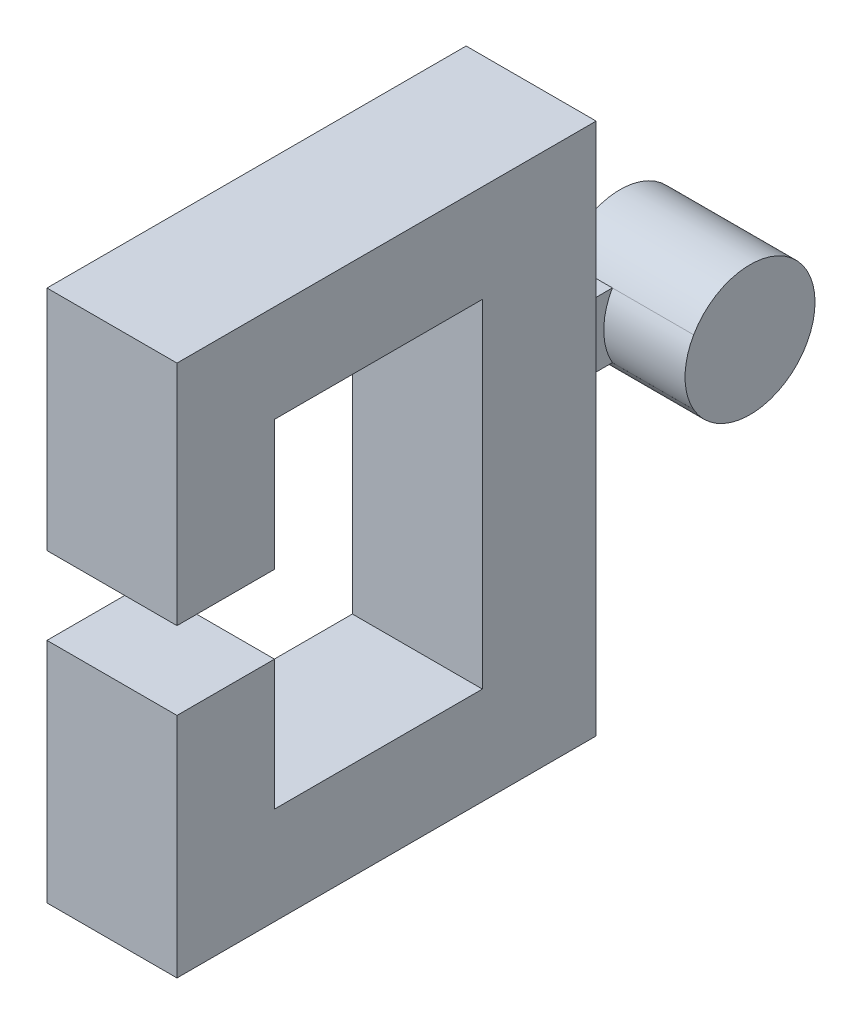
ISO-10303-21;
HEADER;
FILE_DESCRIPTION(('STEP AP214'),'2;1');
FILE_NAME('part.step','',(''),(''),'','','');
FILE_SCHEMA(('AUTOMOTIVE_DESIGN { 1 0 10303 214 1 1 1 1 }'));
ENDSEC;
DATA;
#1=APPLICATION_CONTEXT('core data for automotive mechanical design processes');
#2=APPLICATION_PROTOCOL_DEFINITION('international standard','automotive_design',2000,#1);
#3=PRODUCT_CONTEXT('',#1,'mechanical');
#4=PRODUCT('Part','Part','',(#3));
#5=PRODUCT_RELATED_PRODUCT_CATEGORY('part','',(#4));
#6=PRODUCT_DEFINITION_FORMATION('','',#4);
#7=PRODUCT_DEFINITION_CONTEXT('part definition',#1,'design');
#8=PRODUCT_DEFINITION('design','',#6,#7);
#9=PRODUCT_DEFINITION_SHAPE('','',#8);
#10=(LENGTH_UNIT() NAMED_UNIT(*) SI_UNIT(.MILLI.,.METRE.));
#11=(NAMED_UNIT(*) PLANE_ANGLE_UNIT() SI_UNIT($,.RADIAN.));
#12=(NAMED_UNIT(*) SI_UNIT($,.STERADIAN.) SOLID_ANGLE_UNIT());
#13=UNCERTAINTY_MEASURE_WITH_UNIT(LENGTH_MEASURE(1.E-05),#10,'distance_accuracy_value','');
#14=(GEOMETRIC_REPRESENTATION_CONTEXT(3) GLOBAL_UNCERTAINTY_ASSIGNED_CONTEXT((#13)) GLOBAL_UNIT_ASSIGNED_CONTEXT((#10,
#11,#12)) REPRESENTATION_CONTEXT('',''));
#15=CARTESIAN_POINT('',(0.,0.,0.));
#16=DIRECTION('',(0.,0.,1.));
#17=DIRECTION('',(1.,0.,0.));
#18=AXIS2_PLACEMENT_3D('',#15,#16,#17);
#19=CARTESIAN_POINT('',(25.4,45.69968,-81.8896));
#20=DIRECTION('',(0.,1.,0.));
#21=DIRECTION('',(0.,0.,1.));
#22=AXIS2_PLACEMENT_3D('',#19,#20,#21);
#23=PLANE('',#22);
#24=DIRECTION('',(0.,0.,-1.));
#25=VECTOR('',#24,1.);
#26=CARTESIAN_POINT('',(9.525,45.69968,-100.9396));
#27=LINE('',#26,#25);
#28=CARTESIAN_POINT('',(9.525,45.69968,-81.8896));
#29=VERTEX_POINT('',#28);
#30=CARTESIAN_POINT('',(9.525,45.69968,-100.933765342779));
#31=VERTEX_POINT('',#30);
#32=EDGE_CURVE('E274',#29,#31,#27,.T.);
#33=ORIENTED_EDGE('',*,*,#32,.F.);
#34=DIRECTION('',(-1.,0.,0.));
#35=VECTOR('',#34,1.);
#36=CARTESIAN_POINT('',(25.4,45.69968,-81.8896));
#37=LINE('',#36,#35);
#38=CARTESIAN_POINT('',(0.,45.69968,-81.8896));
#39=VERTEX_POINT('',#38);
#40=EDGE_CURVE('E257',#29,#39,#37,.T.);
#41=ORIENTED_EDGE('',*,*,#40,.T.);
#42=DIRECTION('',(0.,0.,-1.));
#43=VECTOR('',#42,1.);
#44=CARTESIAN_POINT('',(0.,45.69968,-81.8896));
#45=LINE('',#44,#43);
#46=CARTESIAN_POINT('',(0.,45.69968,-100.933765342779));
#47=VERTEX_POINT('',#46);
#48=EDGE_CURVE('E193',#39,#47,#45,.T.);
#49=ORIENTED_EDGE('',*,*,#48,.T.);
#50=DIRECTION('',(-1.,0.,0.));
#51=VECTOR('',#50,1.);
#52=CARTESIAN_POINT('',(25.4,45.69968,-100.933765342779));
#53=LINE('',#52,#51);
#54=EDGE_CURVE('E253',#31,#47,#53,.T.);
#55=ORIENTED_EDGE('',*,*,#54,.F.);
#56=EDGE_LOOP('',(#33,#41,#49,#55));
#57=FACE_BOUND('',#56,.T.);
#58=ADVANCED_FACE('F43',(#57),#23,.F.);
#59=CARTESIAN_POINT('',(25.4,58.34888,-100.9396));
#60=DIRECTION('',(0.,-1.,0.));
#61=DIRECTION('',(0.,0.,-1.));
#62=AXIS2_PLACEMENT_3D('',#59,#60,#61);
#63=PLANE('',#62);
#64=DIRECTION('',(0.,0.,1.));
#65=VECTOR('',#64,1.);
#66=CARTESIAN_POINT('',(9.525,58.34888,-81.8896));
#67=LINE('',#66,#65);
#68=CARTESIAN_POINT('',(9.525,58.34888,-100.9396));
#69=VERTEX_POINT('',#68);
#70=CARTESIAN_POINT('',(9.525,58.34888,-81.8896));
#71=VERTEX_POINT('',#70);
#72=EDGE_CURVE('E307',#69,#71,#67,.T.);
#73=ORIENTED_EDGE('',*,*,#72,.F.);
#74=DIRECTION('',(-1.,0.,0.));
#75=VECTOR('',#74,1.);
#76=CARTESIAN_POINT('',(25.4,58.34888,-100.9396));
#77=LINE('',#76,#75);
#78=CARTESIAN_POINT('',(0.,58.34888,-100.9396));
#79=VERTEX_POINT('',#78);
#80=EDGE_CURVE('E249',#69,#79,#77,.T.);
#81=ORIENTED_EDGE('',*,*,#80,.T.);
#82=DIRECTION('',(0.,0.,1.));
#83=VECTOR('',#82,1.);
#84=CARTESIAN_POINT('',(0.,58.34888,-100.9396));
#85=LINE('',#84,#83);
#86=CARTESIAN_POINT('',(0.,58.34888,-81.8896));
#87=VERTEX_POINT('',#86);
#88=EDGE_CURVE('E199',#79,#87,#85,.T.);
#89=ORIENTED_EDGE('',*,*,#88,.T.);
#90=DIRECTION('',(-1.,0.,0.));
#91=VECTOR('',#90,1.);
#92=CARTESIAN_POINT('',(25.4,58.34888,-81.8896));
#93=LINE('',#92,#91);
#94=EDGE_CURVE('E247',#71,#87,#93,.T.);
#95=ORIENTED_EDGE('',*,*,#94,.F.);
#96=EDGE_LOOP('',(#73,#81,#89,#95));
#97=FACE_BOUND('',#96,.T.);
#98=ADVANCED_FACE('F310',(#97),#63,.F.);
#99=CARTESIAN_POINT('',(25.4,52.0192,-111.949829384422));
#100=DIRECTION('',(1.,0.,0.));
#101=DIRECTION('',(0.,0.,-1.));
#102=AXIS2_PLACEMENT_3D('',#99,#100,#101);
#103=PLANE('',#102);
#104=DIRECTION('',(0.,1.,0.));
#105=VECTOR('',#104,1.);
#106=CARTESIAN_POINT('',(25.4,0.,-81.8896));
#107=LINE('',#106,#105);
#108=CARTESIAN_POINT('',(25.4,0.,-81.8896));
#109=VERTEX_POINT('',#108);
#110=CARTESIAN_POINT('',(25.4,104.0384,-81.8896));
#111=VERTEX_POINT('',#110);
#112=EDGE_CURVE('E132',#109,#111,#107,.T.);
#113=ORIENTED_EDGE('',*,*,#112,.T.);
#114=DIRECTION('',(0.,0.,1.));
#115=VECTOR('',#114,1.);
#116=CARTESIAN_POINT('',(25.4,104.0384,0.));
#117=LINE('',#116,#115);
#118=CARTESIAN_POINT('',(25.4,104.0384,0.));
#119=VERTEX_POINT('',#118);
#120=EDGE_CURVE('E320',#111,#119,#117,.T.);
#121=ORIENTED_EDGE('',*,*,#120,.T.);
#122=DIRECTION('',(0.,-1.,0.));
#123=VECTOR('',#122,1.);
#124=CARTESIAN_POINT('',(25.4,59.6138,0.));
#125=LINE('',#124,#123);
#126=CARTESIAN_POINT('',(25.4,59.6138,0.));
#127=VERTEX_POINT('',#126);
#128=EDGE_CURVE('E322',#119,#127,#125,.T.);
#129=ORIENTED_EDGE('',*,*,#128,.T.);
#130=DIRECTION('',(0.,0.,-1.));
#131=VECTOR('',#130,1.);
#132=CARTESIAN_POINT('',(25.4,59.6138,-19.05));
#133=LINE('',#132,#131);
#134=CARTESIAN_POINT('',(25.4,59.6138,-19.05));
#135=VERTEX_POINT('',#134);
#136=EDGE_CURVE('E325',#127,#135,#133,.T.);
#137=ORIENTED_EDGE('',*,*,#136,.T.);
#138=DIRECTION('',(0.,1.,0.));
#139=VECTOR('',#138,1.);
#140=CARTESIAN_POINT('',(25.4,84.9884,-19.05));
#141=LINE('',#140,#139);
#142=CARTESIAN_POINT('',(25.4,84.9884,-19.05));
#143=VERTEX_POINT('',#142);
#144=EDGE_CURVE('E331',#135,#143,#141,.T.);
#145=ORIENTED_EDGE('',*,*,#144,.T.);
#146=DIRECTION('',(0.,0.,-1.));
#147=VECTOR('',#146,1.);
#148=CARTESIAN_POINT('',(25.4,84.9884,-59.6646));
#149=LINE('',#148,#147);
#150=CARTESIAN_POINT('',(25.4,84.9884,-59.6646));
#151=VERTEX_POINT('',#150);
#152=EDGE_CURVE('E333',#143,#151,#149,.T.);
#153=ORIENTED_EDGE('',*,*,#152,.T.);
#154=DIRECTION('',(0.,-1.,0.));
#155=VECTOR('',#154,1.);
#156=CARTESIAN_POINT('',(25.4,19.05,-59.6646));
#157=LINE('',#156,#155);
#158=CARTESIAN_POINT('',(25.4,19.05,-59.6646));
#159=VERTEX_POINT('',#158);
#160=EDGE_CURVE('E335',#151,#159,#157,.T.);
#161=ORIENTED_EDGE('',*,*,#160,.T.);
#162=DIRECTION('',(0.,0.,1.));
#163=VECTOR('',#162,1.);
#164=CARTESIAN_POINT('',(25.4,19.05,-19.05));
#165=LINE('',#164,#163);
#166=CARTESIAN_POINT('',(25.4,19.05,-19.05));
#167=VERTEX_POINT('',#166);
#168=EDGE_CURVE('E166',#159,#167,#165,.T.);
#169=ORIENTED_EDGE('',*,*,#168,.T.);
#170=DIRECTION('',(0.,1.,0.));
#171=VECTOR('',#170,1.);
#172=CARTESIAN_POINT('',(25.4,44.4246,-19.05));
#173=LINE('',#172,#171);
#174=CARTESIAN_POINT('',(25.4,44.4246,-19.05));
#175=VERTEX_POINT('',#174);
#176=EDGE_CURVE('E159',#167,#175,#173,.T.);
#177=ORIENTED_EDGE('',*,*,#176,.T.);
#178=DIRECTION('',(0.,0.,1.));
#179=VECTOR('',#178,1.);
#180=CARTESIAN_POINT('',(25.4,44.4246,0.));
#181=LINE('',#180,#179);
#182=CARTESIAN_POINT('',(25.4,44.4246,0.));
#183=VERTEX_POINT('',#182);
#184=EDGE_CURVE('E163',#175,#183,#181,.T.);
#185=ORIENTED_EDGE('',*,*,#184,.T.);
#186=DIRECTION('',(0.,-1.,0.));
#187=VECTOR('',#186,1.);
#188=CARTESIAN_POINT('',(25.4,0.,0.));
#189=LINE('',#188,#187);
#190=CARTESIAN_POINT('',(25.4,0.,0.));
#191=VERTEX_POINT('',#190);
#192=EDGE_CURVE('E66',#183,#191,#189,.T.);
#193=ORIENTED_EDGE('',*,*,#192,.T.);
#194=DIRECTION('',(0.,0.,-1.));
#195=VECTOR('',#194,1.);
#196=CARTESIAN_POINT('',(25.4,0.,0.));
#197=LINE('',#196,#195);
#198=EDGE_CURVE('E222',#191,#109,#197,.T.);
#199=ORIENTED_EDGE('',*,*,#198,.T.);
#200=EDGE_LOOP('',(#113,#121,#129,#137,#145,#153,#161,#169,#177,#185,#193,#199));
#201=FACE_BOUND('',#200,.T.);
#202=ADVANCED_FACE('F161',(#201),#103,.T.);
#203=DIRECTION('',(0.,0.,-1.));
#204=VECTOR('',#203,1.);
#205=CARTESIAN_POINT('',(25.4,45.69968,-111.949829384422));
#206=LINE('',#205,#204);
#207=CARTESIAN_POINT('',(25.4,45.69968,-100.933765342779));
#208=VERTEX_POINT('',#207);
#209=CARTESIAN_POINT('',(25.4,45.69968,-100.9396));
#210=VERTEX_POINT('',#209);
#211=EDGE_CURVE('E11',#208,#210,#206,.T.);
#212=ORIENTED_EDGE('',*,*,#211,.F.);
#213=CARTESIAN_POINT('',(25.4,52.0192,-111.949829384422));
#214=DIRECTION('',(1.,0.,0.));
#215=DIRECTION('',(0.,0.,-1.));
#216=AXIS2_PLACEMENT_3D('',#213,#214,#215);
#217=CIRCLE('',#216,12.7);
#218=CARTESIAN_POINT('',(25.4,58.34888,-100.9396));
#219=VERTEX_POINT('',#218);
#220=EDGE_CURVE('E323',#208,#219,#217,.T.);
#221=ORIENTED_EDGE('',*,*,#220,.T.);
#222=CARTESIAN_POINT('',(25.4,52.02428,-111.940992924242));
#223=DIRECTION('',(-1.,0.,0.));
#224=DIRECTION('',(0.,0.,-1.));
#225=AXIS2_PLACEMENT_3D('',#222,#223,#224);
#226=CIRCLE('',#225,12.6898073836276);
#227=EDGE_CURVE('E292',#210,#219,#226,.T.);
#228=ORIENTED_EDGE('',*,*,#227,.F.);
#229=EDGE_LOOP('',(#212,#221,#228));
#230=FACE_BOUND('',#229,.T.);
#231=ADVANCED_FACE('F356',(#230),#103,.T.);
#232=CARTESIAN_POINT('',(25.4,0.,0.));
#233=DIRECTION('',(0.,1.,0.));
#234=DIRECTION('',(0.,0.,1.));
#235=AXIS2_PLACEMENT_3D('',#232,#233,#234);
#236=PLANE('',#235);
#237=DIRECTION('',(0.,0.,-1.));
#238=VECTOR('',#237,1.);
#239=CARTESIAN_POINT('',(0.,0.,0.));
#240=LINE('',#239,#238);
#241=CARTESIAN_POINT('',(0.,0.,0.));
#242=VERTEX_POINT('',#241);
#243=CARTESIAN_POINT('',(0.,0.,-81.8896));
#244=VERTEX_POINT('',#243);
#245=EDGE_CURVE('E187',#242,#244,#240,.T.);
#246=ORIENTED_EDGE('',*,*,#245,.T.);
#247=DIRECTION('',(-1.,0.,0.));
#248=VECTOR('',#247,1.);
#249=CARTESIAN_POINT('',(25.4,0.,-81.8896));
#250=LINE('',#249,#248);
#251=EDGE_CURVE('E51',#109,#244,#250,.T.);
#252=ORIENTED_EDGE('',*,*,#251,.F.);
#253=ORIENTED_EDGE('',*,*,#198,.F.);
#254=DIRECTION('',(-1.,0.,0.));
#255=VECTOR('',#254,1.);
#256=CARTESIAN_POINT('',(25.4,0.,0.));
#257=LINE('',#256,#255);
#258=EDGE_CURVE('E183',#191,#242,#257,.T.);
#259=ORIENTED_EDGE('',*,*,#258,.T.);
#260=EDGE_LOOP('',(#246,#252,#253,#259));
#261=FACE_BOUND('',#260,.T.);
#262=ADVANCED_FACE('F45',(#261),#236,.F.);
#263=CARTESIAN_POINT('',(25.4,52.0192,-111.949829384422));
#264=DIRECTION('',(-1.,0.,0.));
#265=DIRECTION('',(0.,0.,1.));
#266=AXIS2_PLACEMENT_3D('',#263,#264,#265);
#267=CYLINDRICAL_SURFACE('',#266,12.7);
#268=CARTESIAN_POINT('',(0.,52.0192,-111.949829384422));
#269=DIRECTION('',(1.,0.,0.));
#270=DIRECTION('',(0.,0.,-1.));
#271=AXIS2_PLACEMENT_3D('',#268,#269,#270);
#272=CIRCLE('',#271,12.7);
#273=EDGE_CURVE('E196',#47,#79,#272,.T.);
#274=ORIENTED_EDGE('',*,*,#273,.T.);
#275=ORIENTED_EDGE('',*,*,#80,.F.);
#276=EDGE_CURVE('E250',#219,#69,#77,.T.);
#277=ORIENTED_EDGE('',*,*,#276,.F.);
#278=ORIENTED_EDGE('',*,*,#220,.F.);
#279=EDGE_CURVE('E254',#208,#31,#53,.T.);
#280=ORIENTED_EDGE('',*,*,#279,.T.);
#281=ORIENTED_EDGE('',*,*,#54,.T.);
#282=EDGE_LOOP('',(#274,#275,#277,#278,#280,#281));
#283=FACE_BOUND('',#282,.T.);
#284=ADVANCED_FACE('F312',(#283),#267,.T.);
#285=CARTESIAN_POINT('',(25.4,58.34888,-81.8896));
#286=DIRECTION('',(0.,0.,1.));
#287=DIRECTION('',(0.,-1.,0.));
#288=AXIS2_PLACEMENT_3D('',#285,#286,#287);
#289=PLANE('',#288);
#290=DIRECTION('',(0.,1.,0.));
#291=VECTOR('',#290,1.);
#292=CARTESIAN_POINT('',(0.,58.34888,-81.8896));
#293=LINE('',#292,#291);
#294=CARTESIAN_POINT('',(0.,104.0384,-81.8896));
#295=VERTEX_POINT('',#294);
#296=EDGE_CURVE('E202',#87,#295,#293,.T.);
#297=ORIENTED_EDGE('',*,*,#296,.T.);
#298=DIRECTION('',(-1.,0.,0.));
#299=VECTOR('',#298,1.);
#300=CARTESIAN_POINT('',(25.4,104.0384,-81.8896));
#301=LINE('',#300,#299);
#302=EDGE_CURVE('E244',#111,#295,#301,.T.);
#303=ORIENTED_EDGE('',*,*,#302,.F.);
#304=ORIENTED_EDGE('',*,*,#112,.F.);
#305=ORIENTED_EDGE('',*,*,#251,.T.);
#306=DIRECTION('',(0.,1.,0.));
#307=VECTOR('',#306,1.);
#308=CARTESIAN_POINT('',(0.,0.,-81.8896));
#309=LINE('',#308,#307);
#310=EDGE_CURVE('E190',#244,#39,#309,.T.);
#311=ORIENTED_EDGE('',*,*,#310,.T.);
#312=ORIENTED_EDGE('',*,*,#40,.F.);
#313=DIRECTION('',(0.,-1.,0.));
#314=VECTOR('',#313,1.);
#315=CARTESIAN_POINT('',(9.525,45.69968,-81.8896));
#316=LINE('',#315,#314);
#317=EDGE_CURVE('E278',#71,#29,#316,.T.);
#318=ORIENTED_EDGE('',*,*,#317,.F.);
#319=ORIENTED_EDGE('',*,*,#94,.T.);
#320=EDGE_LOOP('',(#297,#303,#304,#305,#311,#312,#318,#319));
#321=FACE_BOUND('',#320,.T.);
#322=ADVANCED_FACE('F259',(#321),#289,.F.);
#323=CARTESIAN_POINT('',(25.4,104.0384,0.));
#324=DIRECTION('',(0.,-1.,0.));
#325=DIRECTION('',(0.,0.,-1.));
#326=AXIS2_PLACEMENT_3D('',#323,#324,#325);
#327=PLANE('',#326);
#328=DIRECTION('',(0.,0.,1.));
#329=VECTOR('',#328,1.);
#330=CARTESIAN_POINT('',(0.,104.0384,0.));
#331=LINE('',#330,#329);
#332=CARTESIAN_POINT('',(0.,104.0384,0.));
#333=VERTEX_POINT('',#332);
#334=EDGE_CURVE('E204',#295,#333,#331,.T.);
#335=ORIENTED_EDGE('',*,*,#334,.T.);
#336=DIRECTION('',(-1.,0.,0.));
#337=VECTOR('',#336,1.);
#338=CARTESIAN_POINT('',(25.4,104.0384,0.));
#339=LINE('',#338,#337);
#340=EDGE_CURVE('E241',#119,#333,#339,.T.);
#341=ORIENTED_EDGE('',*,*,#340,.F.);
#342=ORIENTED_EDGE('',*,*,#120,.F.);
#343=ORIENTED_EDGE('',*,*,#302,.T.);
#344=EDGE_LOOP('',(#335,#341,#342,#343));
#345=FACE_BOUND('',#344,.T.);
#346=ADVANCED_FACE('F318',(#345),#327,.F.);
#347=CARTESIAN_POINT('',(25.4,59.6138,0.));
#348=DIRECTION('',(0.,0.,-1.));
#349=DIRECTION('',(0.,1.,0.));
#350=AXIS2_PLACEMENT_3D('',#347,#348,#349);
#351=PLANE('',#350);
#352=DIRECTION('',(0.,-1.,0.));
#353=VECTOR('',#352,1.);
#354=CARTESIAN_POINT('',(0.,59.6138,0.));
#355=LINE('',#354,#353);
#356=CARTESIAN_POINT('',(0.,59.6138,0.));
#357=VERTEX_POINT('',#356);
#358=EDGE_CURVE('E206',#333,#357,#355,.T.);
#359=ORIENTED_EDGE('',*,*,#358,.T.);
#360=DIRECTION('',(-1.,0.,0.));
#361=VECTOR('',#360,1.);
#362=CARTESIAN_POINT('',(25.4,59.6138,0.));
#363=LINE('',#362,#361);
#364=EDGE_CURVE('E238',#127,#357,#363,.T.);
#365=ORIENTED_EDGE('',*,*,#364,.F.);
#366=ORIENTED_EDGE('',*,*,#128,.F.);
#367=ORIENTED_EDGE('',*,*,#340,.T.);
#368=EDGE_LOOP('',(#359,#365,#366,#367));
#369=FACE_BOUND('',#368,.T.);
#370=ADVANCED_FACE('F378',(#369),#351,.F.);
#371=CARTESIAN_POINT('',(25.4,59.6138,-19.05));
#372=DIRECTION('',(0.,1.,0.));
#373=DIRECTION('',(0.,0.,1.));
#374=AXIS2_PLACEMENT_3D('',#371,#372,#373);
#375=PLANE('',#374);
#376=DIRECTION('',(0.,0.,-1.));
#377=VECTOR('',#376,1.);
#378=CARTESIAN_POINT('',(0.,59.6138,-19.05));
#379=LINE('',#378,#377);
#380=CARTESIAN_POINT('',(0.,59.6138,-19.05));
#381=VERTEX_POINT('',#380);
#382=EDGE_CURVE('E208',#357,#381,#379,.T.);
#383=ORIENTED_EDGE('',*,*,#382,.T.);
#384=DIRECTION('',(-1.,0.,0.));
#385=VECTOR('',#384,1.);
#386=CARTESIAN_POINT('',(25.4,59.6138,-19.05));
#387=LINE('',#386,#385);
#388=EDGE_CURVE('E235',#135,#381,#387,.T.);
#389=ORIENTED_EDGE('',*,*,#388,.F.);
#390=ORIENTED_EDGE('',*,*,#136,.F.);
#391=ORIENTED_EDGE('',*,*,#364,.T.);
#392=EDGE_LOOP('',(#383,#389,#390,#391));
#393=FACE_BOUND('',#392,.T.);
#394=ADVANCED_FACE('F381',(#393),#375,.F.);
#395=CARTESIAN_POINT('',(25.4,84.9884,-19.05));
#396=DIRECTION('',(0.,0.,1.));
#397=DIRECTION('',(1.,0.,0.));
#398=AXIS2_PLACEMENT_3D('',#395,#396,#397);
#399=PLANE('',#398);
#400=DIRECTION('',(0.,1.,0.));
#401=VECTOR('',#400,1.);
#402=CARTESIAN_POINT('',(0.,84.9884,-19.05));
#403=LINE('',#402,#401);
#404=CARTESIAN_POINT('',(0.,84.9884,-19.05));
#405=VERTEX_POINT('',#404);
#406=EDGE_CURVE('E210',#381,#405,#403,.T.);
#407=ORIENTED_EDGE('',*,*,#406,.T.);
#408=DIRECTION('',(-1.,0.,0.));
#409=VECTOR('',#408,1.);
#410=CARTESIAN_POINT('',(25.4,84.9884,-19.05));
#411=LINE('',#410,#409);
#412=EDGE_CURVE('E232',#143,#405,#411,.T.);
#413=ORIENTED_EDGE('',*,*,#412,.F.);
#414=ORIENTED_EDGE('',*,*,#144,.F.);
#415=ORIENTED_EDGE('',*,*,#388,.T.);
#416=EDGE_LOOP('',(#407,#413,#414,#415));
#417=FACE_BOUND('',#416,.T.);
#418=ADVANCED_FACE('F385',(#417),#399,.F.);
#419=CARTESIAN_POINT('',(25.4,84.9884,-59.6646));
#420=DIRECTION('',(0.,1.,0.));
#421=DIRECTION('',(0.,0.,1.));
#422=AXIS2_PLACEMENT_3D('',#419,#420,#421);
#423=PLANE('',#422);
#424=DIRECTION('',(0.,0.,-1.));
#425=VECTOR('',#424,1.);
#426=CARTESIAN_POINT('',(0.,84.9884,-59.6646));
#427=LINE('',#426,#425);
#428=CARTESIAN_POINT('',(0.,84.9884,-59.6646));
#429=VERTEX_POINT('',#428);
#430=EDGE_CURVE('E212',#405,#429,#427,.T.);
#431=ORIENTED_EDGE('',*,*,#430,.T.);
#432=DIRECTION('',(-1.,0.,0.));
#433=VECTOR('',#432,1.);
#434=CARTESIAN_POINT('',(25.4,84.9884,-59.6646));
#435=LINE('',#434,#433);
#436=EDGE_CURVE('E229',#151,#429,#435,.T.);
#437=ORIENTED_EDGE('',*,*,#436,.F.);
#438=ORIENTED_EDGE('',*,*,#152,.F.);
#439=ORIENTED_EDGE('',*,*,#412,.T.);
#440=EDGE_LOOP('',(#431,#437,#438,#439));
#441=FACE_BOUND('',#440,.T.);
#442=ADVANCED_FACE('F389',(#441),#423,.F.);
#443=CARTESIAN_POINT('',(25.4,19.05,-59.6646));
#444=DIRECTION('',(0.,0.,-1.));
#445=DIRECTION('',(0.,1.,0.));
#446=AXIS2_PLACEMENT_3D('',#443,#444,#445);
#447=PLANE('',#446);
#448=DIRECTION('',(0.,-1.,0.));
#449=VECTOR('',#448,1.);
#450=CARTESIAN_POINT('',(0.,19.05,-59.6646));
#451=LINE('',#450,#449);
#452=CARTESIAN_POINT('',(0.,19.05,-59.6646));
#453=VERTEX_POINT('',#452);
#454=EDGE_CURVE('E214',#429,#453,#451,.T.);
#455=ORIENTED_EDGE('',*,*,#454,.T.);
#456=DIRECTION('',(-1.,0.,0.));
#457=VECTOR('',#456,1.);
#458=CARTESIAN_POINT('',(25.4,19.05,-59.6646));
#459=LINE('',#458,#457);
#460=EDGE_CURVE('E226',#159,#453,#459,.T.);
#461=ORIENTED_EDGE('',*,*,#460,.F.);
#462=ORIENTED_EDGE('',*,*,#160,.F.);
#463=ORIENTED_EDGE('',*,*,#436,.T.);
#464=EDGE_LOOP('',(#455,#461,#462,#463));
#465=FACE_BOUND('',#464,.T.);
#466=ADVANCED_FACE('F341',(#465),#447,.F.);
#467=CARTESIAN_POINT('',(25.4,19.05,-19.05));
#468=DIRECTION('',(0.,-1.,0.));
#469=DIRECTION('',(0.,0.,-1.));
#470=AXIS2_PLACEMENT_3D('',#467,#468,#469);
#471=PLANE('',#470);
#472=DIRECTION('',(0.,0.,1.));
#473=VECTOR('',#472,1.);
#474=CARTESIAN_POINT('',(0.,19.05,-19.05));
#475=LINE('',#474,#473);
#476=CARTESIAN_POINT('',(0.,19.05,-19.05));
#477=VERTEX_POINT('',#476);
#478=EDGE_CURVE('E216',#453,#477,#475,.T.);
#479=ORIENTED_EDGE('',*,*,#478,.T.);
#480=DIRECTION('',(-1.,0.,0.));
#481=VECTOR('',#480,1.);
#482=CARTESIAN_POINT('',(25.4,19.05,-19.05));
#483=LINE('',#482,#481);
#484=EDGE_CURVE('E178',#167,#477,#483,.T.);
#485=ORIENTED_EDGE('',*,*,#484,.F.);
#486=ORIENTED_EDGE('',*,*,#168,.F.);
#487=ORIENTED_EDGE('',*,*,#460,.T.);
#488=EDGE_LOOP('',(#479,#485,#486,#487));
#489=FACE_BOUND('',#488,.T.);
#490=ADVANCED_FACE('F345',(#489),#471,.F.);
#491=CARTESIAN_POINT('',(25.4,44.4246,-19.05));
#492=DIRECTION('',(0.,0.,1.));
#493=DIRECTION('',(0.,-1.,0.));
#494=AXIS2_PLACEMENT_3D('',#491,#492,#493);
#495=PLANE('',#494);
#496=DIRECTION('',(0.,1.,0.));
#497=VECTOR('',#496,1.);
#498=CARTESIAN_POINT('',(0.,44.4246,-19.05));
#499=LINE('',#498,#497);
#500=CARTESIAN_POINT('',(0.,44.4246,-19.05));
#501=VERTEX_POINT('',#500);
#502=EDGE_CURVE('E175',#477,#501,#499,.T.);
#503=ORIENTED_EDGE('',*,*,#502,.T.);
#504=DIRECTION('',(-1.,0.,0.));
#505=VECTOR('',#504,1.);
#506=CARTESIAN_POINT('',(25.4,44.4246,-19.05));
#507=LINE('',#506,#505);
#508=EDGE_CURVE('E172',#175,#501,#507,.T.);
#509=ORIENTED_EDGE('',*,*,#508,.F.);
#510=ORIENTED_EDGE('',*,*,#176,.F.);
#511=ORIENTED_EDGE('',*,*,#484,.T.);
#512=EDGE_LOOP('',(#503,#509,#510,#511));
#513=FACE_BOUND('',#512,.T.);
#514=ADVANCED_FACE('F173',(#513),#495,.F.);
#515=CARTESIAN_POINT('',(25.4,44.4246,0.));
#516=DIRECTION('',(0.,-1.,0.));
#517=DIRECTION('',(0.,0.,-1.));
#518=AXIS2_PLACEMENT_3D('',#515,#516,#517);
#519=PLANE('',#518);
#520=DIRECTION('',(0.,0.,1.));
#521=VECTOR('',#520,1.);
#522=CARTESIAN_POINT('',(0.,44.4246,0.));
#523=LINE('',#522,#521);
#524=CARTESIAN_POINT('',(0.,44.4246,0.));
#525=VERTEX_POINT('',#524);
#526=EDGE_CURVE('E219',#501,#525,#523,.T.);
#527=ORIENTED_EDGE('',*,*,#526,.T.);
#528=DIRECTION('',(-1.,0.,0.));
#529=VECTOR('',#528,1.);
#530=CARTESIAN_POINT('',(25.4,44.4246,0.));
#531=LINE('',#530,#529);
#532=EDGE_CURVE('E179',#183,#525,#531,.T.);
#533=ORIENTED_EDGE('',*,*,#532,.F.);
#534=ORIENTED_EDGE('',*,*,#184,.F.);
#535=ORIENTED_EDGE('',*,*,#508,.T.);
#536=EDGE_LOOP('',(#527,#533,#534,#535));
#537=FACE_BOUND('',#536,.T.);
#538=ADVANCED_FACE('F181',(#537),#519,.F.);
#539=CARTESIAN_POINT('',(25.4,0.,0.));
#540=DIRECTION('',(0.,0.,-1.));
#541=DIRECTION('',(-1.,0.,0.));
#542=AXIS2_PLACEMENT_3D('',#539,#540,#541);
#543=PLANE('',#542);
#544=DIRECTION('',(0.,-1.,0.));
#545=VECTOR('',#544,1.);
#546=CARTESIAN_POINT('',(0.,0.,0.));
#547=LINE('',#546,#545);
#548=EDGE_CURVE('E123',#525,#242,#547,.T.);
#549=ORIENTED_EDGE('',*,*,#548,.T.);
#550=ORIENTED_EDGE('',*,*,#258,.F.);
#551=ORIENTED_EDGE('',*,*,#192,.F.);
#552=ORIENTED_EDGE('',*,*,#532,.T.);
#553=EDGE_LOOP('',(#549,#550,#551,#552));
#554=FACE_BOUND('',#553,.T.);
#555=ADVANCED_FACE('F346',(#554),#543,.F.);
#556=CARTESIAN_POINT('',(0.,52.0192,-111.949829384422));
#557=DIRECTION('',(1.,0.,0.));
#558=DIRECTION('',(0.,0.,-1.));
#559=AXIS2_PLACEMENT_3D('',#556,#557,#558);
#560=PLANE('',#559);
#561=ORIENTED_EDGE('',*,*,#245,.F.);
#562=ORIENTED_EDGE('',*,*,#548,.F.);
#563=ORIENTED_EDGE('',*,*,#526,.F.);
#564=ORIENTED_EDGE('',*,*,#502,.F.);
#565=ORIENTED_EDGE('',*,*,#478,.F.);
#566=ORIENTED_EDGE('',*,*,#454,.F.);
#567=ORIENTED_EDGE('',*,*,#430,.F.);
#568=ORIENTED_EDGE('',*,*,#406,.F.);
#569=ORIENTED_EDGE('',*,*,#382,.F.);
#570=ORIENTED_EDGE('',*,*,#358,.F.);
#571=ORIENTED_EDGE('',*,*,#334,.F.);
#572=ORIENTED_EDGE('',*,*,#296,.F.);
#573=ORIENTED_EDGE('',*,*,#88,.F.);
#574=ORIENTED_EDGE('',*,*,#273,.F.);
#575=ORIENTED_EDGE('',*,*,#48,.F.);
#576=ORIENTED_EDGE('',*,*,#310,.F.);
#577=EDGE_LOOP('',(#561,#562,#563,#564,#565,#566,#567,#568,#569,#570,#571,#572,#573,#574,#575,#576));
#578=FACE_BOUND('',#577,.T.);
#579=ADVANCED_FACE('F266',(#578),#560,.F.);
#580=CARTESIAN_POINT('',(9.525,45.69968,-100.9396));
#581=DIRECTION('',(0.,-1.,0.));
#582=DIRECTION('',(0.,0.,-1.));
#583=AXIS2_PLACEMENT_3D('',#580,#581,#582);
#584=PLANE('',#583);
#585=ORIENTED_EDGE('',*,*,#211,.T.);
#586=DIRECTION('',(1.,0.,0.));
#587=VECTOR('',#586,1.);
#588=CARTESIAN_POINT('',(9.525,45.69968,-100.9396));
#589=LINE('',#588,#587);
#590=CARTESIAN_POINT('',(9.525,45.69968,-100.9396));
#591=VERTEX_POINT('',#590);
#592=EDGE_CURVE('E58',#591,#210,#589,.T.);
#593=ORIENTED_EDGE('',*,*,#592,.F.);
#594=EDGE_CURVE('E298',#31,#591,#27,.T.);
#595=ORIENTED_EDGE('',*,*,#594,.F.);
#596=ORIENTED_EDGE('',*,*,#279,.F.);
#597=EDGE_LOOP('',(#585,#593,#595,#596));
#598=FACE_BOUND('',#597,.T.);
#599=ADVANCED_FACE('F353',(#598),#584,.F.);
#600=CARTESIAN_POINT('',(9.525,52.02428,-111.940992924242));
#601=DIRECTION('',(1.,0.,0.));
#602=DIRECTION('',(0.,0.,-1.));
#603=AXIS2_PLACEMENT_3D('',#600,#601,#602);
#604=CYLINDRICAL_SURFACE('',#603,12.6898073836276);
#605=ORIENTED_EDGE('',*,*,#227,.T.);
#606=ORIENTED_EDGE('',*,*,#276,.T.);
#607=CARTESIAN_POINT('',(9.525,52.02428,-111.940992924242));
#608=DIRECTION('',(-1.,0.,0.));
#609=DIRECTION('',(0.,0.,-1.));
#610=AXIS2_PLACEMENT_3D('',#607,#608,#609);
#611=CIRCLE('',#610,12.6898073836276);
#612=EDGE_CURVE('E301',#591,#69,#611,.T.);
#613=ORIENTED_EDGE('',*,*,#612,.F.);
#614=ORIENTED_EDGE('',*,*,#592,.T.);
#615=EDGE_LOOP('',(#605,#606,#613,#614));
#616=FACE_BOUND('',#615,.T.);
#617=ADVANCED_FACE('F300',(#616),#604,.T.);
#618=CARTESIAN_POINT('',(9.525,52.02428,-111.940992924242));
#619=DIRECTION('',(1.,0.,0.));
#620=DIRECTION('',(0.,0.,-1.));
#621=AXIS2_PLACEMENT_3D('',#618,#619,#620);
#622=PLANE('',#621);
#623=ORIENTED_EDGE('',*,*,#32,.T.);
#624=ORIENTED_EDGE('',*,*,#594,.T.);
#625=ORIENTED_EDGE('',*,*,#612,.T.);
#626=ORIENTED_EDGE('',*,*,#72,.T.);
#627=ORIENTED_EDGE('',*,*,#317,.T.);
#628=EDGE_LOOP('',(#623,#624,#625,#626,#627));
#629=FACE_BOUND('',#628,.T.);
#630=ADVANCED_FACE('F306',(#629),#622,.T.);
#631=CLOSED_SHELL('',(#58,#98,#202,#231,#262,#284,#322,#346,#370,#394,#418,#442,#466,#490,#514,
#538,#555,#579,#599,#617,#630));
#632=MANIFOLD_SOLID_BREP('B2',#631);
#633=ADVANCED_BREP_SHAPE_REPRESENTATION('',(#18,#632),#14);
#634=SHAPE_DEFINITION_REPRESENTATION(#9,#633);
ENDSEC;
END-ISO-10303-21;
